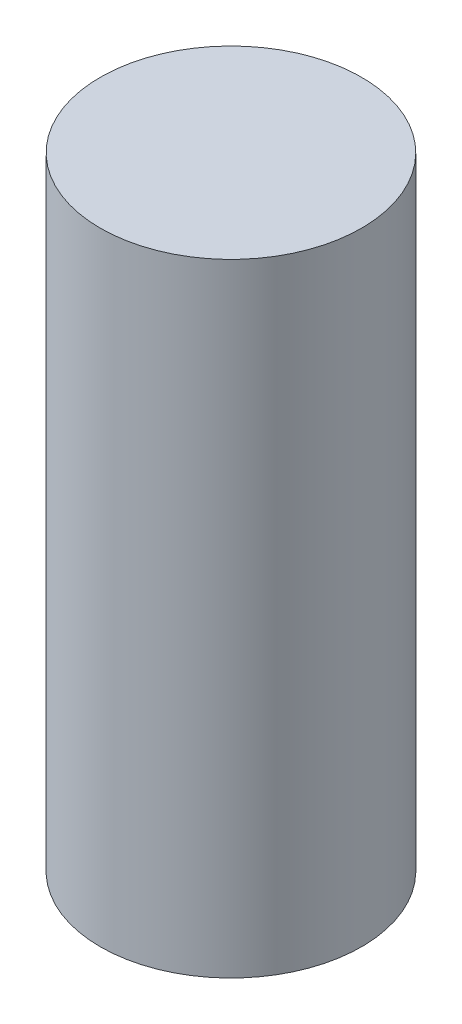
ISO-10303-21;
HEADER;
FILE_DESCRIPTION(('STEP AP214'),'2;1');
FILE_NAME('part.step','',(''),(''),'','','');
FILE_SCHEMA(('AUTOMOTIVE_DESIGN { 1 0 10303 214 1 1 1 1 }'));
ENDSEC;
DATA;
#1=APPLICATION_CONTEXT('core data for automotive mechanical design processes');
#2=APPLICATION_PROTOCOL_DEFINITION('international standard','automotive_design',2000,#1);
#3=PRODUCT_CONTEXT('',#1,'mechanical');
#4=PRODUCT('Part','Part','',(#3));
#5=PRODUCT_RELATED_PRODUCT_CATEGORY('part','',(#4));
#6=PRODUCT_DEFINITION_FORMATION('','',#4);
#7=PRODUCT_DEFINITION_CONTEXT('part definition',#1,'design');
#8=PRODUCT_DEFINITION('design','',#6,#7);
#9=PRODUCT_DEFINITION_SHAPE('','',#8);
#10=(LENGTH_UNIT() NAMED_UNIT(*) SI_UNIT(.MILLI.,.METRE.));
#11=(NAMED_UNIT(*) PLANE_ANGLE_UNIT() SI_UNIT($,.RADIAN.));
#12=(NAMED_UNIT(*) SI_UNIT($,.STERADIAN.) SOLID_ANGLE_UNIT());
#13=UNCERTAINTY_MEASURE_WITH_UNIT(LENGTH_MEASURE(1.E-05),#10,'distance_accuracy_value','');
#14=(GEOMETRIC_REPRESENTATION_CONTEXT(3) GLOBAL_UNCERTAINTY_ASSIGNED_CONTEXT((#13)) GLOBAL_UNIT_ASSIGNED_CONTEXT((#10,
#11,#12)) REPRESENTATION_CONTEXT('',''));
#15=CARTESIAN_POINT('',(0.,0.,0.));
#16=DIRECTION('',(0.,0.,1.));
#17=DIRECTION('',(1.,0.,0.));
#18=AXIS2_PLACEMENT_3D('',#15,#16,#17);
#19=CARTESIAN_POINT('',(0.,50.,0.));
#20=DIRECTION('',(0.,-1.,0.));
#21=DIRECTION('',(0.,0.,-1.));
#22=AXIS2_PLACEMENT_3D('',#19,#20,#21);
#23=CYLINDRICAL_SURFACE('',#22,10.5);
#24=CARTESIAN_POINT('',(0.,50.,0.));
#25=DIRECTION('',(0.,1.,0.));
#26=DIRECTION('',(0.,0.,1.));
#27=AXIS2_PLACEMENT_3D('',#24,#25,#26);
#28=CIRCLE('',#27,10.5);
#29=CARTESIAN_POINT('',(0.,50.,10.5));
#30=VERTEX_POINT('',#29);
#31=EDGE_CURVE('E10',#30,#30,#28,.T.);
#32=ORIENTED_EDGE('',*,*,#31,.F.);
#33=EDGE_LOOP('',(#32));
#34=FACE_BOUND('',#33,.T.);
#35=CARTESIAN_POINT('',(0.,0.,0.));
#36=DIRECTION('',(0.,1.,0.));
#37=DIRECTION('',(0.,0.,1.));
#38=AXIS2_PLACEMENT_3D('',#35,#36,#37);
#39=CIRCLE('',#38,10.5);
#40=CARTESIAN_POINT('',(0.,0.,10.5));
#41=VERTEX_POINT('',#40);
#42=EDGE_CURVE('E44',#41,#41,#39,.T.);
#43=ORIENTED_EDGE('',*,*,#42,.T.);
#44=EDGE_LOOP('',(#43));
#45=FACE_BOUND('',#44,.T.);
#46=ADVANCED_FACE('F41',(#34,#45),#23,.T.);
#47=CARTESIAN_POINT('',(0.,50.,0.));
#48=DIRECTION('',(0.,1.,0.));
#49=DIRECTION('',(0.,0.,1.));
#50=AXIS2_PLACEMENT_3D('',#47,#48,#49);
#51=PLANE('',#50);
#52=ORIENTED_EDGE('',*,*,#31,.T.);
#53=EDGE_LOOP('',(#52));
#54=FACE_BOUND('',#53,.T.);
#55=ADVANCED_FACE('F56',(#54),#51,.T.);
#56=CARTESIAN_POINT('',(0.,0.,0.));
#57=DIRECTION('',(0.,1.,0.));
#58=DIRECTION('',(0.,0.,1.));
#59=AXIS2_PLACEMENT_3D('',#56,#57,#58);
#60=PLANE('',#59);
#61=ORIENTED_EDGE('',*,*,#42,.F.);
#62=EDGE_LOOP('',(#61));
#63=FACE_BOUND('',#62,.T.);
#64=ADVANCED_FACE('F54',(#63),#60,.F.);
#65=CLOSED_SHELL('',(#46,#55,#64));
#66=MANIFOLD_SOLID_BREP('B2',#65);
#67=ADVANCED_BREP_SHAPE_REPRESENTATION('',(#18,#66),#14);
#68=SHAPE_DEFINITION_REPRESENTATION(#9,#67);
ENDSEC;
END-ISO-10303-21;
